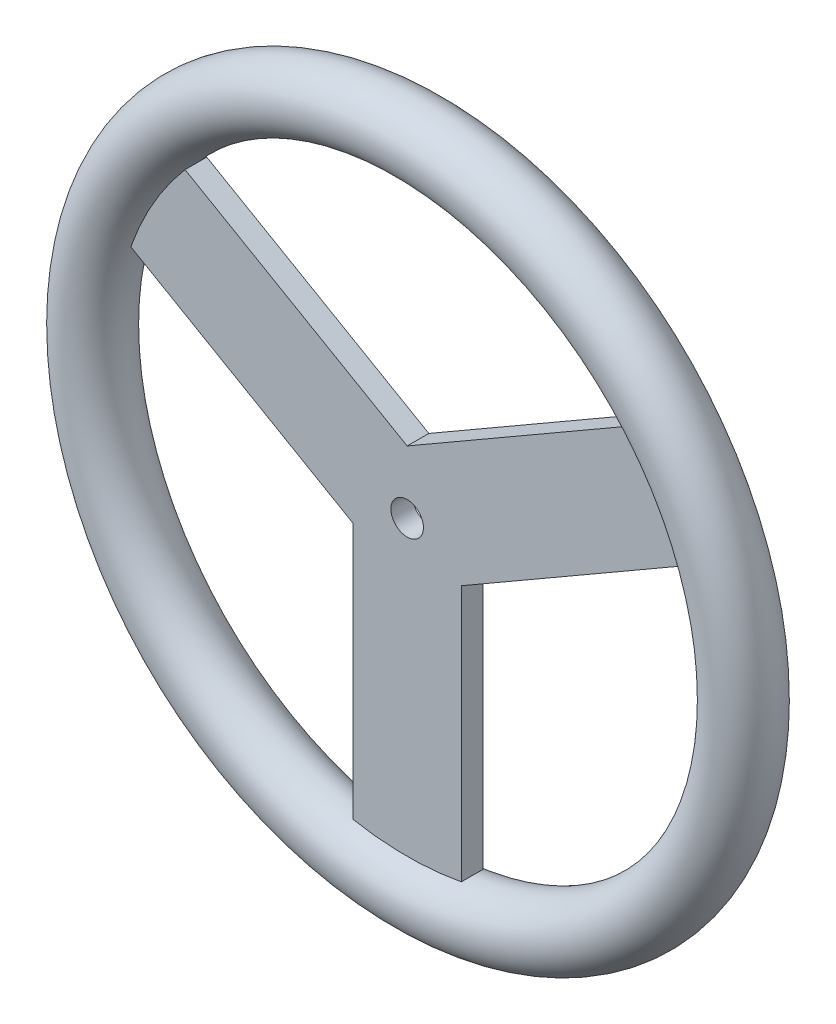
ISO-10303-21;
HEADER;
FILE_DESCRIPTION(('STEP AP214'),'2;1');
FILE_NAME('part.step','',(''),(''),'','','');
FILE_SCHEMA(('AUTOMOTIVE_DESIGN { 1 0 10303 214 1 1 1 1 }'));
ENDSEC;
DATA;
#1=APPLICATION_CONTEXT('core data for automotive mechanical design processes');
#2=APPLICATION_PROTOCOL_DEFINITION('international standard','automotive_design',2000,#1);
#3=PRODUCT_CONTEXT('',#1,'mechanical');
#4=PRODUCT('Part','Part','',(#3));
#5=PRODUCT_RELATED_PRODUCT_CATEGORY('part','',(#4));
#6=PRODUCT_DEFINITION_FORMATION('','',#4);
#7=PRODUCT_DEFINITION_CONTEXT('part definition',#1,'design');
#8=PRODUCT_DEFINITION('design','',#6,#7);
#9=PRODUCT_DEFINITION_SHAPE('','',#8);
#10=(LENGTH_UNIT() NAMED_UNIT(*) SI_UNIT(.MILLI.,.METRE.));
#11=(NAMED_UNIT(*) PLANE_ANGLE_UNIT() SI_UNIT($,.RADIAN.));
#12=(NAMED_UNIT(*) SI_UNIT($,.STERADIAN.) SOLID_ANGLE_UNIT());
#13=UNCERTAINTY_MEASURE_WITH_UNIT(LENGTH_MEASURE(1.E-05),#10,'distance_accuracy_value','');
#14=(GEOMETRIC_REPRESENTATION_CONTEXT(3) GLOBAL_UNCERTAINTY_ASSIGNED_CONTEXT((#13)) GLOBAL_UNIT_ASSIGNED_CONTEXT((#10,
#11,#12)) REPRESENTATION_CONTEXT('',''));
#15=CARTESIAN_POINT('',(0.,0.,0.));
#16=DIRECTION('',(0.,0.,1.));
#17=DIRECTION('',(1.,0.,0.));
#18=AXIS2_PLACEMENT_3D('',#15,#16,#17);
#19=CARTESIAN_POINT('',(0.,0.,-5.));
#20=DIRECTION('',(0.,0.,1.));
#21=DIRECTION('',(1.,0.,0.));
#22=AXIS2_PLACEMENT_3D('',#19,#20,#21);
#23=CYLINDRICAL_SURFACE('',#22,135.);
#24=DIRECTION('',(0.,0.,1.));
#25=VECTOR('',#24,1.);
#26=CARTESIAN_POINT('',(-127.39125293076,44.6818607124976,-5.));
#27=LINE('',#26,#25);
#28=CARTESIAN_POINT('',(-127.39125293076,44.6818607124976,-5.));
#29=VERTEX_POINT('',#28);
#30=CARTESIAN_POINT('',(-127.39125293076,44.6818607124976,5.));
#31=VERTEX_POINT('',#30);
#32=EDGE_CURVE('E111',#29,#31,#27,.T.);
#33=ORIENTED_EDGE('',*,*,#32,.T.);
#34=CARTESIAN_POINT('',(0.,0.,5.));
#35=DIRECTION('',(0.,0.,1.));
#36=DIRECTION('',(1.,0.,0.));
#37=AXIS2_PLACEMENT_3D('',#34,#35,#36);
#38=CIRCLE('',#37,135.);
#39=CARTESIAN_POINT('',(-102.39125293076,87.9831309017194,5.));
#40=VERTEX_POINT('',#39);
#41=EDGE_CURVE('E114',#40,#31,#38,.T.);
#42=ORIENTED_EDGE('',*,*,#41,.F.);
#43=DIRECTION('',(0.,0.,1.));
#44=VECTOR('',#43,1.);
#45=CARTESIAN_POINT('',(-102.39125293076,87.9831309017194,-5.));
#46=LINE('',#45,#44);
#47=CARTESIAN_POINT('',(-102.39125293076,87.9831309017194,-5.));
#48=VERTEX_POINT('',#47);
#49=EDGE_CURVE('E12',#48,#40,#46,.T.);
#50=ORIENTED_EDGE('',*,*,#49,.F.);
#51=CARTESIAN_POINT('',(0.,0.,-5.));
#52=DIRECTION('',(0.,0.,1.));
#53=DIRECTION('',(1.,0.,0.));
#54=AXIS2_PLACEMENT_3D('',#51,#52,#53);
#55=CIRCLE('',#54,135.);
#56=EDGE_CURVE('E115',#48,#29,#55,.T.);
#57=ORIENTED_EDGE('',*,*,#56,.T.);
#58=EDGE_LOOP('',(#33,#42,#50,#57));
#59=FACE_BOUND('',#58,.T.);
#60=ADVANCED_FACE('F43',(#59),#23,.T.);
#61=CARTESIAN_POINT('',(-102.39125293076,87.9831309017194,-5.));
#62=DIRECTION('',(0.500000000000004,0.866025403784437,0.));
#63=DIRECTION('',(-0.866025403784437,0.500000000000004,0.));
#64=AXIS2_PLACEMENT_3D('',#61,#62,#63);
#65=PLANE('',#64);
#66=ORIENTED_EDGE('',*,*,#49,.T.);
#67=DIRECTION('',(-0.866025403784436,0.500000000000004,0.));
#68=VECTOR('',#67,1.);
#69=CARTESIAN_POINT('',(-102.39125293076,87.9831309017194,5.));
#70=LINE('',#69,#68);
#71=CARTESIAN_POINT('',(0.,28.8675134594814,5.));
#72=VERTEX_POINT('',#71);
#73=EDGE_CURVE('E132',#72,#40,#70,.T.);
#74=ORIENTED_EDGE('',*,*,#73,.F.);
#75=DIRECTION('',(0.,0.,1.));
#76=VECTOR('',#75,1.);
#77=CARTESIAN_POINT('',(0.,28.8675134594814,-5.));
#78=LINE('',#77,#76);
#79=CARTESIAN_POINT('',(0.,28.8675134594814,-5.));
#80=VERTEX_POINT('',#79);
#81=EDGE_CURVE('E51',#80,#72,#78,.T.);
#82=ORIENTED_EDGE('',*,*,#81,.F.);
#83=DIRECTION('',(-0.866025403784436,0.500000000000004,0.));
#84=VECTOR('',#83,1.);
#85=CARTESIAN_POINT('',(-102.39125293076,87.9831309017194,-5.));
#86=LINE('',#85,#84);
#87=EDGE_CURVE('E120',#80,#48,#86,.T.);
#88=ORIENTED_EDGE('',*,*,#87,.T.);
#89=EDGE_LOOP('',(#66,#74,#82,#88));
#90=FACE_BOUND('',#89,.T.);
#91=ADVANCED_FACE('F212',(#90),#65,.T.);
#92=CARTESIAN_POINT('',(0.,28.8675134594814,-5.));
#93=DIRECTION('',(-0.500000000000004,0.866025403784436,0.));
#94=DIRECTION('',(-0.866025403784436,-0.500000000000004,0.));
#95=AXIS2_PLACEMENT_3D('',#92,#93,#94);
#96=PLANE('',#95);
#97=ORIENTED_EDGE('',*,*,#81,.T.);
#98=DIRECTION('',(-0.866025403784436,-0.500000000000004,0.));
#99=VECTOR('',#98,1.);
#100=CARTESIAN_POINT('',(0.,28.8675134594814,5.));
#101=LINE('',#100,#99);
#102=CARTESIAN_POINT('',(102.39125293076,87.9831309017195,5.));
#103=VERTEX_POINT('',#102);
#104=EDGE_CURVE('E151',#103,#72,#101,.T.);
#105=ORIENTED_EDGE('',*,*,#104,.F.);
#106=DIRECTION('',(0.,0.,1.));
#107=VECTOR('',#106,1.);
#108=CARTESIAN_POINT('',(102.39125293076,87.9831309017195,-5.));
#109=LINE('',#108,#107);
#110=CARTESIAN_POINT('',(102.39125293076,87.9831309017195,-5.));
#111=VERTEX_POINT('',#110);
#112=EDGE_CURVE('E176',#111,#103,#109,.T.);
#113=ORIENTED_EDGE('',*,*,#112,.F.);
#114=DIRECTION('',(-0.866025403784436,-0.500000000000004,0.));
#115=VECTOR('',#114,1.);
#116=CARTESIAN_POINT('',(0.,28.8675134594814,-5.));
#117=LINE('',#116,#115);
#118=EDGE_CURVE('E172',#111,#80,#117,.T.);
#119=ORIENTED_EDGE('',*,*,#118,.T.);
#120=EDGE_LOOP('',(#97,#105,#113,#119));
#121=FACE_BOUND('',#120,.T.);
#122=ADVANCED_FACE('F210',(#121),#96,.T.);
#123=CARTESIAN_POINT('',(0.,0.,-5.));
#124=DIRECTION('',(0.,0.,1.));
#125=DIRECTION('',(1.,0.,0.));
#126=AXIS2_PLACEMENT_3D('',#123,#124,#125);
#127=CYLINDRICAL_SURFACE('',#126,135.);
#128=ORIENTED_EDGE('',*,*,#112,.T.);
#129=CARTESIAN_POINT('',(0.,0.,5.));
#130=DIRECTION('',(0.,0.,1.));
#131=DIRECTION('',(1.,0.,0.));
#132=AXIS2_PLACEMENT_3D('',#129,#130,#131);
#133=CIRCLE('',#132,135.);
#134=CARTESIAN_POINT('',(127.39125293076,44.6818607124977,5.));
#135=VERTEX_POINT('',#134);
#136=EDGE_CURVE('E148',#135,#103,#133,.T.);
#137=ORIENTED_EDGE('',*,*,#136,.F.);
#138=DIRECTION('',(0.,0.,1.));
#139=VECTOR('',#138,1.);
#140=CARTESIAN_POINT('',(127.39125293076,44.6818607124977,-5.));
#141=LINE('',#140,#139);
#142=CARTESIAN_POINT('',(127.39125293076,44.6818607124977,-5.));
#143=VERTEX_POINT('',#142);
#144=EDGE_CURVE('E178',#143,#135,#141,.T.);
#145=ORIENTED_EDGE('',*,*,#144,.F.);
#146=CARTESIAN_POINT('',(0.,0.,-5.));
#147=DIRECTION('',(0.,0.,1.));
#148=DIRECTION('',(1.,0.,0.));
#149=AXIS2_PLACEMENT_3D('',#146,#147,#148);
#150=CIRCLE('',#149,135.);
#151=EDGE_CURVE('E169',#143,#111,#150,.T.);
#152=ORIENTED_EDGE('',*,*,#151,.T.);
#153=EDGE_LOOP('',(#128,#137,#145,#152));
#154=FACE_BOUND('',#153,.T.);
#155=ADVANCED_FACE('F208',(#154),#127,.T.);
#156=CARTESIAN_POINT('',(127.39125293076,44.6818607124977,-5.));
#157=DIRECTION('',(0.500000000000004,-0.866025403784436,0.));
#158=DIRECTION('',(0.866025403784436,0.500000000000004,0.));
#159=AXIS2_PLACEMENT_3D('',#156,#157,#158);
#160=PLANE('',#159);
#161=ORIENTED_EDGE('',*,*,#144,.T.);
#162=DIRECTION('',(0.866025403784436,0.500000000000004,0.));
#163=VECTOR('',#162,1.);
#164=CARTESIAN_POINT('',(127.39125293076,44.6818607124977,5.));
#165=LINE('',#164,#163);
#166=CARTESIAN_POINT('',(25.,-14.4337567297406,5.));
#167=VERTEX_POINT('',#166);
#168=EDGE_CURVE('E145',#167,#135,#165,.T.);
#169=ORIENTED_EDGE('',*,*,#168,.F.);
#170=DIRECTION('',(0.,0.,1.));
#171=VECTOR('',#170,1.);
#172=CARTESIAN_POINT('',(25.,-14.4337567297406,-5.));
#173=LINE('',#172,#171);
#174=CARTESIAN_POINT('',(25.,-14.4337567297406,-5.));
#175=VERTEX_POINT('',#174);
#176=EDGE_CURVE('E180',#175,#167,#173,.T.);
#177=ORIENTED_EDGE('',*,*,#176,.F.);
#178=DIRECTION('',(0.866025403784436,0.500000000000004,0.));
#179=VECTOR('',#178,1.);
#180=CARTESIAN_POINT('',(127.39125293076,44.6818607124977,-5.));
#181=LINE('',#180,#179);
#182=EDGE_CURVE('E166',#175,#143,#181,.T.);
#183=ORIENTED_EDGE('',*,*,#182,.T.);
#184=EDGE_LOOP('',(#161,#169,#177,#183));
#185=FACE_BOUND('',#184,.T.);
#186=ADVANCED_FACE('F203',(#185),#160,.T.);
#187=CARTESIAN_POINT('',(25.,-14.4337567297406,-5.));
#188=DIRECTION('',(1.,0.,0.));
#189=DIRECTION('',(0.,1.,0.));
#190=AXIS2_PLACEMENT_3D('',#187,#188,#189);
#191=PLANE('',#190);
#192=ORIENTED_EDGE('',*,*,#176,.T.);
#193=DIRECTION('',(0.,1.,0.));
#194=VECTOR('',#193,1.);
#195=CARTESIAN_POINT('',(25.,-14.4337567297406,5.));
#196=LINE('',#195,#194);
#197=CARTESIAN_POINT('',(25.,-132.664991614216,5.));
#198=VERTEX_POINT('',#197);
#199=EDGE_CURVE('E142',#198,#167,#196,.T.);
#200=ORIENTED_EDGE('',*,*,#199,.F.);
#201=DIRECTION('',(0.,0.,1.));
#202=VECTOR('',#201,1.);
#203=CARTESIAN_POINT('',(25.,-132.664991614216,-5.));
#204=LINE('',#203,#202);
#205=CARTESIAN_POINT('',(25.,-132.664991614216,-5.));
#206=VERTEX_POINT('',#205);
#207=EDGE_CURVE('E182',#206,#198,#204,.T.);
#208=ORIENTED_EDGE('',*,*,#207,.F.);
#209=DIRECTION('',(0.,1.,0.));
#210=VECTOR('',#209,1.);
#211=CARTESIAN_POINT('',(25.,-14.4337567297406,-5.));
#212=LINE('',#211,#210);
#213=EDGE_CURVE('E163',#206,#175,#212,.T.);
#214=ORIENTED_EDGE('',*,*,#213,.T.);
#215=EDGE_LOOP('',(#192,#200,#208,#214));
#216=FACE_BOUND('',#215,.T.);
#217=ADVANCED_FACE('F196',(#216),#191,.T.);
#218=CARTESIAN_POINT('',(0.,0.,-5.));
#219=DIRECTION('',(0.,0.,1.));
#220=DIRECTION('',(1.,0.,0.));
#221=AXIS2_PLACEMENT_3D('',#218,#219,#220);
#222=CYLINDRICAL_SURFACE('',#221,135.);
#223=ORIENTED_EDGE('',*,*,#207,.T.);
#224=CARTESIAN_POINT('',(0.,0.,5.));
#225=DIRECTION('',(0.,0.,1.));
#226=DIRECTION('',(1.,0.,0.));
#227=AXIS2_PLACEMENT_3D('',#224,#225,#226);
#228=CIRCLE('',#227,135.);
#229=CARTESIAN_POINT('',(-25.0000000000001,-132.664991614216,5.));
#230=VERTEX_POINT('',#229);
#231=EDGE_CURVE('E139',#230,#198,#228,.T.);
#232=ORIENTED_EDGE('',*,*,#231,.F.);
#233=DIRECTION('',(0.,0.,1.));
#234=VECTOR('',#233,1.);
#235=CARTESIAN_POINT('',(-25.0000000000001,-132.664991614216,-5.));
#236=LINE('',#235,#234);
#237=CARTESIAN_POINT('',(-25.0000000000001,-132.664991614216,-5.));
#238=VERTEX_POINT('',#237);
#239=EDGE_CURVE('E184',#238,#230,#236,.T.);
#240=ORIENTED_EDGE('',*,*,#239,.F.);
#241=CARTESIAN_POINT('',(0.,0.,-5.));
#242=DIRECTION('',(0.,0.,1.));
#243=DIRECTION('',(1.,0.,0.));
#244=AXIS2_PLACEMENT_3D('',#241,#242,#243);
#245=CIRCLE('',#244,135.);
#246=EDGE_CURVE('E160',#238,#206,#245,.T.);
#247=ORIENTED_EDGE('',*,*,#246,.T.);
#248=EDGE_LOOP('',(#223,#232,#240,#247));
#249=FACE_BOUND('',#248,.T.);
#250=ADVANCED_FACE('F193',(#249),#222,.T.);
#251=CARTESIAN_POINT('',(-25.,-14.4337567297405,-5.));
#252=DIRECTION('',(-1.,0.,0.));
#253=DIRECTION('',(0.,-1.,0.));
#254=AXIS2_PLACEMENT_3D('',#251,#252,#253);
#255=PLANE('',#254);
#256=ORIENTED_EDGE('',*,*,#239,.T.);
#257=DIRECTION('',(0.,-1.,0.));
#258=VECTOR('',#257,1.);
#259=CARTESIAN_POINT('',(-25.,-14.4337567297405,5.));
#260=LINE('',#259,#258);
#261=CARTESIAN_POINT('',(-25.,-14.4337567297405,5.));
#262=VERTEX_POINT('',#261);
#263=EDGE_CURVE('E127',#262,#230,#260,.T.);
#264=ORIENTED_EDGE('',*,*,#263,.F.);
#265=DIRECTION('',(0.,0.,1.));
#266=VECTOR('',#265,1.);
#267=CARTESIAN_POINT('',(-25.,-14.4337567297405,-5.));
#268=LINE('',#267,#266);
#269=CARTESIAN_POINT('',(-25.,-14.4337567297405,-5.));
#270=VERTEX_POINT('',#269);
#271=EDGE_CURVE('E119',#270,#262,#268,.T.);
#272=ORIENTED_EDGE('',*,*,#271,.F.);
#273=DIRECTION('',(0.,-1.,0.));
#274=VECTOR('',#273,1.);
#275=CARTESIAN_POINT('',(-25.,-14.4337567297405,-5.));
#276=LINE('',#275,#274);
#277=EDGE_CURVE('E157',#270,#238,#276,.T.);
#278=ORIENTED_EDGE('',*,*,#277,.T.);
#279=EDGE_LOOP('',(#256,#264,#272,#278));
#280=FACE_BOUND('',#279,.T.);
#281=ADVANCED_FACE('F187',(#280),#255,.T.);
#282=CARTESIAN_POINT('',(-127.39125293076,44.6818607124976,-5.));
#283=DIRECTION('',(-0.500000000000004,-0.866025403784437,0.));
#284=DIRECTION('',(0.866025403784437,-0.500000000000004,0.));
#285=AXIS2_PLACEMENT_3D('',#282,#283,#284);
#286=PLANE('',#285);
#287=ORIENTED_EDGE('',*,*,#271,.T.);
#288=DIRECTION('',(0.866025403784436,-0.500000000000004,0.));
#289=VECTOR('',#288,1.);
#290=CARTESIAN_POINT('',(-127.39125293076,44.6818607124976,5.));
#291=LINE('',#290,#289);
#292=EDGE_CURVE('E122',#31,#262,#291,.T.);
#293=ORIENTED_EDGE('',*,*,#292,.F.);
#294=ORIENTED_EDGE('',*,*,#32,.F.);
#295=DIRECTION('',(0.866025403784436,-0.500000000000004,0.));
#296=VECTOR('',#295,1.);
#297=CARTESIAN_POINT('',(-127.39125293076,44.6818607124976,-5.));
#298=LINE('',#297,#296);
#299=EDGE_CURVE('E155',#29,#270,#298,.T.);
#300=ORIENTED_EDGE('',*,*,#299,.T.);
#301=EDGE_LOOP('',(#287,#293,#294,#300));
#302=FACE_BOUND('',#301,.T.);
#303=ADVANCED_FACE('F123',(#302),#286,.T.);
#304=CARTESIAN_POINT('',(0.,0.,-5.));
#305=DIRECTION('',(0.,0.,1.));
#306=DIRECTION('',(1.,0.,0.));
#307=AXIS2_PLACEMENT_3D('',#304,#305,#306);
#308=PLANE('',#307);
#309=CARTESIAN_POINT('',(0.,0.,-5.));
#310=DIRECTION('',(0.,0.,1.));
#311=DIRECTION('',(1.,0.,0.));
#312=AXIS2_PLACEMENT_3D('',#309,#310,#311);
#313=CIRCLE('',#312,7.5);
#314=CARTESIAN_POINT('',(7.5,0.,-5.));
#315=VERTEX_POINT('',#314);
#316=EDGE_CURVE('E133',#315,#315,#313,.F.);
#317=ORIENTED_EDGE('',*,*,#316,.F.);
#318=EDGE_LOOP('',(#317));
#319=FACE_BOUND('',#318,.T.);
#320=ORIENTED_EDGE('',*,*,#56,.F.);
#321=ORIENTED_EDGE('',*,*,#87,.F.);
#322=ORIENTED_EDGE('',*,*,#118,.F.);
#323=ORIENTED_EDGE('',*,*,#151,.F.);
#324=ORIENTED_EDGE('',*,*,#182,.F.);
#325=ORIENTED_EDGE('',*,*,#213,.F.);
#326=ORIENTED_EDGE('',*,*,#246,.F.);
#327=ORIENTED_EDGE('',*,*,#277,.F.);
#328=ORIENTED_EDGE('',*,*,#299,.F.);
#329=EDGE_LOOP('',(#320,#321,#322,#323,#324,#325,#326,#327,#328));
#330=FACE_BOUND('',#329,.T.);
#331=ADVANCED_FACE('F199',(#319,#330),#308,.F.);
#332=CARTESIAN_POINT('',(0.,0.,5.));
#333=DIRECTION('',(0.,0.,1.));
#334=DIRECTION('',(1.,0.,0.));
#335=AXIS2_PLACEMENT_3D('',#332,#333,#334);
#336=PLANE('',#335);
#337=CARTESIAN_POINT('',(0.,0.,5.));
#338=DIRECTION('',(0.,0.,1.));
#339=DIRECTION('',(1.,0.,0.));
#340=AXIS2_PLACEMENT_3D('',#337,#338,#339);
#341=CIRCLE('',#340,7.5);
#342=CARTESIAN_POINT('',(7.5,0.,5.));
#343=VERTEX_POINT('',#342);
#344=EDGE_CURVE('E46',#343,#343,#341,.F.);
#345=ORIENTED_EDGE('',*,*,#344,.T.);
#346=EDGE_LOOP('',(#345));
#347=FACE_BOUND('',#346,.T.);
#348=ORIENTED_EDGE('',*,*,#41,.T.);
#349=ORIENTED_EDGE('',*,*,#292,.T.);
#350=ORIENTED_EDGE('',*,*,#263,.T.);
#351=ORIENTED_EDGE('',*,*,#231,.T.);
#352=ORIENTED_EDGE('',*,*,#199,.T.);
#353=ORIENTED_EDGE('',*,*,#168,.T.);
#354=ORIENTED_EDGE('',*,*,#136,.T.);
#355=ORIENTED_EDGE('',*,*,#104,.T.);
#356=ORIENTED_EDGE('',*,*,#73,.T.);
#357=EDGE_LOOP('',(#348,#349,#350,#351,#352,#353,#354,#355,#356));
#358=FACE_BOUND('',#357,.T.);
#359=ADVANCED_FACE('F130',(#347,#358),#336,.T.);
#360=CARTESIAN_POINT('',(0.,0.,133.));
#361=DIRECTION('',(0.,0.,-1.));
#362=DIRECTION('',(-1.,0.,0.));
#363=AXIS2_PLACEMENT_3D('',#360,#361,#362);
#364=CYLINDRICAL_SURFACE('',#363,7.5);
#365=ORIENTED_EDGE('',*,*,#344,.F.);
#366=EDGE_LOOP('',(#365));
#367=FACE_BOUND('',#366,.T.);
#368=ORIENTED_EDGE('',*,*,#316,.T.);
#369=EDGE_LOOP('',(#368));
#370=FACE_BOUND('',#369,.T.);
#371=ADVANCED_FACE('F240',(#367,#370),#364,.F.);
#372=CLOSED_SHELL('',(#60,#91,#122,#155,#186,#217,#250,#281,#303,#331,#359,#371));
#373=MANIFOLD_SOLID_BREP('B2',#372);
#374=CARTESIAN_POINT('',(0.,0.,0.));
#375=DIRECTION('',(0.,0.,1.));
#376=DIRECTION('',(1.,0.,0.));
#377=AXIS2_PLACEMENT_3D('',#374,#375,#376);
#378=TOROIDAL_SURFACE('',#377,150.,15.);
#379=CARTESIAN_POINT('',(165.,0.,0.));
#380=VERTEX_POINT('',#379);
#381=VERTEX_LOOP('',#380);
#382=FACE_BOUND('',#381,.T.);
#383=ADVANCED_FACE('F318',(#382),#378,.T.);
#384=CLOSED_SHELL('',(#383));
#385=MANIFOLD_SOLID_BREP('B6',#384);
#386=ADVANCED_BREP_SHAPE_REPRESENTATION('',(#18,#373,#385),#14);
#387=SHAPE_DEFINITION_REPRESENTATION(#9,#386);
ENDSEC;
END-ISO-10303-21;
